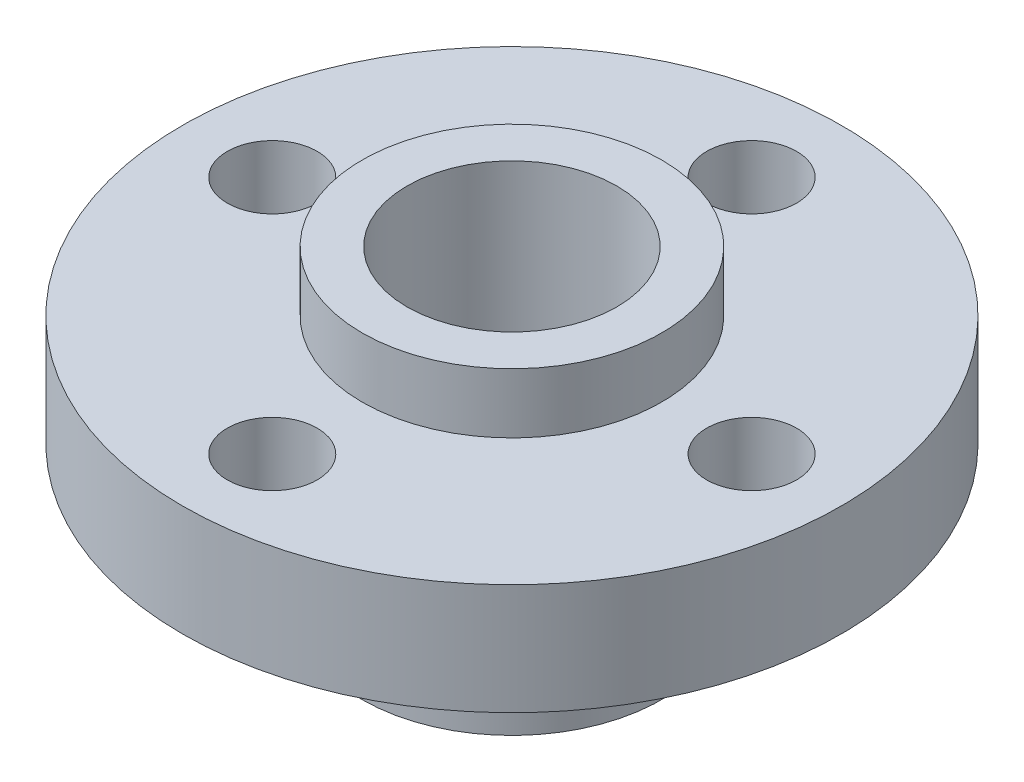
ISO-10303-21;
HEADER;
FILE_DESCRIPTION(('STEP AP214'),'2;1');
FILE_NAME('part.step','',(''),(''),'','','');
FILE_SCHEMA(('AUTOMOTIVE_DESIGN { 1 0 10303 214 1 1 1 1 }'));
ENDSEC;
DATA;
#1=APPLICATION_CONTEXT('core data for automotive mechanical design processes');
#2=APPLICATION_PROTOCOL_DEFINITION('international standard','automotive_design',2000,#1);
#3=PRODUCT_CONTEXT('',#1,'mechanical');
#4=PRODUCT('Part','Part','',(#3));
#5=PRODUCT_RELATED_PRODUCT_CATEGORY('part','',(#4));
#6=PRODUCT_DEFINITION_FORMATION('','',#4);
#7=PRODUCT_DEFINITION_CONTEXT('part definition',#1,'design');
#8=PRODUCT_DEFINITION('design','',#6,#7);
#9=PRODUCT_DEFINITION_SHAPE('','',#8);
#10=(LENGTH_UNIT() NAMED_UNIT(*) SI_UNIT(.MILLI.,.METRE.));
#11=(NAMED_UNIT(*) PLANE_ANGLE_UNIT() SI_UNIT($,.RADIAN.));
#12=(NAMED_UNIT(*) SI_UNIT($,.STERADIAN.) SOLID_ANGLE_UNIT());
#13=UNCERTAINTY_MEASURE_WITH_UNIT(LENGTH_MEASURE(1.E-05),#10,'distance_accuracy_value','');
#14=(GEOMETRIC_REPRESENTATION_CONTEXT(3) GLOBAL_UNCERTAINTY_ASSIGNED_CONTEXT((#13)) GLOBAL_UNIT_ASSIGNED_CONTEXT((#10,
#11,#12)) REPRESENTATION_CONTEXT('',''));
#15=CARTESIAN_POINT('',(0.,0.,0.));
#16=DIRECTION('',(0.,0.,1.));
#17=DIRECTION('',(1.,0.,0.));
#18=AXIS2_PLACEMENT_3D('',#15,#16,#17);
#19=CARTESIAN_POINT('',(0.,3.7,0.));
#20=DIRECTION('',(0.,-1.,0.));
#21=DIRECTION('',(0.,0.,-1.));
#22=AXIS2_PLACEMENT_3D('',#19,#20,#21);
#23=CYLINDRICAL_SURFACE('',#22,11.);
#24=CARTESIAN_POINT('',(0.,3.7,0.));
#25=DIRECTION('',(0.,1.,0.));
#26=DIRECTION('',(0.,0.,1.));
#27=AXIS2_PLACEMENT_3D('',#24,#25,#26);
#28=CIRCLE('',#27,11.);
#29=CARTESIAN_POINT('',(0.,3.7,11.));
#30=VERTEX_POINT('',#29);
#31=EDGE_CURVE('E45',#30,#30,#28,.T.);
#32=ORIENTED_EDGE('',*,*,#31,.F.);
#33=EDGE_LOOP('',(#32));
#34=FACE_BOUND('',#33,.T.);
#35=CARTESIAN_POINT('',(0.,0.,0.));
#36=DIRECTION('',(0.,1.,0.));
#37=DIRECTION('',(0.,0.,1.));
#38=AXIS2_PLACEMENT_3D('',#35,#36,#37);
#39=CIRCLE('',#38,11.);
#40=CARTESIAN_POINT('',(0.,0.,11.));
#41=VERTEX_POINT('',#40);
#42=EDGE_CURVE('E51',#41,#41,#39,.T.);
#43=ORIENTED_EDGE('',*,*,#42,.T.);
#44=EDGE_LOOP('',(#43));
#45=FACE_BOUND('',#44,.T.);
#46=ADVANCED_FACE('F37',(#34,#45),#23,.T.);
#47=CARTESIAN_POINT('',(0.,3.7,0.));
#48=DIRECTION('',(0.,1.,0.));
#49=DIRECTION('',(0.,0.,1.));
#50=AXIS2_PLACEMENT_3D('',#47,#48,#49);
#51=PLANE('',#50);
#52=CARTESIAN_POINT('',(0.,3.7,0.));
#53=DIRECTION('',(0.,1.,0.));
#54=DIRECTION('',(0.,0.,1.));
#55=AXIS2_PLACEMENT_3D('',#52,#53,#54);
#56=CIRCLE('',#55,5.);
#57=CARTESIAN_POINT('',(0.,3.7,5.));
#58=VERTEX_POINT('',#57);
#59=EDGE_CURVE('E10',#58,#58,#56,.T.);
#60=ORIENTED_EDGE('',*,*,#59,.F.);
#61=EDGE_LOOP('',(#60));
#62=FACE_BOUND('',#61,.T.);
#63=CARTESIAN_POINT('',(0.,3.7,-8.));
#64=DIRECTION('',(0.,1.,0.));
#65=DIRECTION('',(0.,0.,1.));
#66=AXIS2_PLACEMENT_3D('',#63,#64,#65);
#67=CIRCLE('',#66,1.5);
#68=CARTESIAN_POINT('',(0.,3.7,-6.5));
#69=VERTEX_POINT('',#68);
#70=EDGE_CURVE('E57',#69,#69,#67,.T.);
#71=ORIENTED_EDGE('',*,*,#70,.F.);
#72=EDGE_LOOP('',(#71));
#73=FACE_BOUND('',#72,.T.);
#74=CARTESIAN_POINT('',(8.,3.7,0.));
#75=DIRECTION('',(0.,1.,0.));
#76=DIRECTION('',(0.,0.,1.));
#77=AXIS2_PLACEMENT_3D('',#74,#75,#76);
#78=CIRCLE('',#77,1.5);
#79=CARTESIAN_POINT('',(8.,3.7,1.5));
#80=VERTEX_POINT('',#79);
#81=EDGE_CURVE('E66',#80,#80,#78,.T.);
#82=ORIENTED_EDGE('',*,*,#81,.F.);
#83=EDGE_LOOP('',(#82));
#84=FACE_BOUND('',#83,.T.);
#85=CARTESIAN_POINT('',(0.,3.7,8.));
#86=DIRECTION('',(0.,1.,0.));
#87=DIRECTION('',(0.,0.,1.));
#88=AXIS2_PLACEMENT_3D('',#85,#86,#87);
#89=CIRCLE('',#88,1.5);
#90=CARTESIAN_POINT('',(0.,3.7,9.5));
#91=VERTEX_POINT('',#90);
#92=EDGE_CURVE('E74',#91,#91,#89,.T.);
#93=ORIENTED_EDGE('',*,*,#92,.F.);
#94=EDGE_LOOP('',(#93));
#95=FACE_BOUND('',#94,.T.);
#96=CARTESIAN_POINT('',(-8.,3.7,0.));
#97=DIRECTION('',(0.,1.,0.));
#98=DIRECTION('',(0.,0.,1.));
#99=AXIS2_PLACEMENT_3D('',#96,#97,#98);
#100=CIRCLE('',#99,1.5);
#101=CARTESIAN_POINT('',(-8.,3.7,1.5));
#102=VERTEX_POINT('',#101);
#103=EDGE_CURVE('E82',#102,#102,#100,.T.);
#104=ORIENTED_EDGE('',*,*,#103,.F.);
#105=EDGE_LOOP('',(#104));
#106=FACE_BOUND('',#105,.T.);
#107=ORIENTED_EDGE('',*,*,#31,.T.);
#108=EDGE_LOOP('',(#107));
#109=FACE_BOUND('',#108,.T.);
#110=ADVANCED_FACE('F96',(#62,#73,#84,#95,#106,#109),#51,.T.);
#111=CARTESIAN_POINT('',(0.,0.,0.));
#112=DIRECTION('',(0.,1.,0.));
#113=DIRECTION('',(0.,0.,1.));
#114=AXIS2_PLACEMENT_3D('',#111,#112,#113);
#115=PLANE('',#114);
#116=CARTESIAN_POINT('',(0.,0.,0.));
#117=DIRECTION('',(0.,1.,0.));
#118=DIRECTION('',(0.,0.,1.));
#119=AXIS2_PLACEMENT_3D('',#116,#117,#118);
#120=CIRCLE('',#119,5.);
#121=CARTESIAN_POINT('',(0.,0.,5.));
#122=VERTEX_POINT('',#121);
#123=EDGE_CURVE('E40',#122,#122,#120,.T.);
#124=ORIENTED_EDGE('',*,*,#123,.T.);
#125=EDGE_LOOP('',(#124));
#126=FACE_BOUND('',#125,.T.);
#127=CARTESIAN_POINT('',(0.,0.,-8.));
#128=DIRECTION('',(0.,1.,0.));
#129=DIRECTION('',(0.,0.,1.));
#130=AXIS2_PLACEMENT_3D('',#127,#128,#129);
#131=CIRCLE('',#130,1.5);
#132=CARTESIAN_POINT('',(0.,0.,-6.5));
#133=VERTEX_POINT('',#132);
#134=EDGE_CURVE('E61',#133,#133,#131,.F.);
#135=ORIENTED_EDGE('',*,*,#134,.F.);
#136=EDGE_LOOP('',(#135));
#137=FACE_BOUND('',#136,.T.);
#138=CARTESIAN_POINT('',(8.,0.,0.));
#139=DIRECTION('',(0.,1.,0.));
#140=DIRECTION('',(0.,0.,1.));
#141=AXIS2_PLACEMENT_3D('',#138,#139,#140);
#142=CIRCLE('',#141,1.5);
#143=CARTESIAN_POINT('',(8.,0.,1.5));
#144=VERTEX_POINT('',#143);
#145=EDGE_CURVE('E62',#144,#144,#142,.F.);
#146=ORIENTED_EDGE('',*,*,#145,.F.);
#147=EDGE_LOOP('',(#146));
#148=FACE_BOUND('',#147,.T.);
#149=CARTESIAN_POINT('',(0.,0.,8.));
#150=DIRECTION('',(0.,1.,0.));
#151=DIRECTION('',(0.,0.,1.));
#152=AXIS2_PLACEMENT_3D('',#149,#150,#151);
#153=CIRCLE('',#152,1.5);
#154=CARTESIAN_POINT('',(0.,0.,9.5));
#155=VERTEX_POINT('',#154);
#156=EDGE_CURVE('E70',#155,#155,#153,.F.);
#157=ORIENTED_EDGE('',*,*,#156,.F.);
#158=EDGE_LOOP('',(#157));
#159=FACE_BOUND('',#158,.T.);
#160=CARTESIAN_POINT('',(-8.,0.,0.));
#161=DIRECTION('',(0.,1.,0.));
#162=DIRECTION('',(0.,0.,1.));
#163=AXIS2_PLACEMENT_3D('',#160,#161,#162);
#164=CIRCLE('',#163,1.5);
#165=CARTESIAN_POINT('',(-8.,0.,1.5));
#166=VERTEX_POINT('',#165);
#167=EDGE_CURVE('E78',#166,#166,#164,.F.);
#168=ORIENTED_EDGE('',*,*,#167,.F.);
#169=EDGE_LOOP('',(#168));
#170=FACE_BOUND('',#169,.T.);
#171=ORIENTED_EDGE('',*,*,#42,.F.);
#172=EDGE_LOOP('',(#171));
#173=FACE_BOUND('',#172,.T.);
#174=ADVANCED_FACE('F93',(#126,#137,#148,#159,#170,#173),#115,.F.);
#175=CARTESIAN_POINT('',(-8.,-0.00100000000000013,0.));
#176=DIRECTION('',(0.,1.,0.));
#177=DIRECTION('',(0.,0.,1.));
#178=AXIS2_PLACEMENT_3D('',#175,#176,#177);
#179=CYLINDRICAL_SURFACE('',#178,1.5);
#180=ORIENTED_EDGE('',*,*,#103,.T.);
#181=EDGE_LOOP('',(#180));
#182=FACE_BOUND('',#181,.T.);
#183=ORIENTED_EDGE('',*,*,#167,.T.);
#184=EDGE_LOOP('',(#183));
#185=FACE_BOUND('',#184,.T.);
#186=ADVANCED_FACE('F95',(#182,#185),#179,.F.);
#187=CARTESIAN_POINT('',(0.,-0.00100000000000013,8.));
#188=DIRECTION('',(0.,1.,0.));
#189=DIRECTION('',(0.,0.,1.));
#190=AXIS2_PLACEMENT_3D('',#187,#188,#189);
#191=CYLINDRICAL_SURFACE('',#190,1.5);
#192=ORIENTED_EDGE('',*,*,#92,.T.);
#193=EDGE_LOOP('',(#192));
#194=FACE_BOUND('',#193,.T.);
#195=ORIENTED_EDGE('',*,*,#156,.T.);
#196=EDGE_LOOP('',(#195));
#197=FACE_BOUND('',#196,.T.);
#198=ADVANCED_FACE('F102',(#194,#197),#191,.F.);
#199=CARTESIAN_POINT('',(8.,-0.00100000000000013,0.));
#200=DIRECTION('',(0.,1.,0.));
#201=DIRECTION('',(0.,0.,1.));
#202=AXIS2_PLACEMENT_3D('',#199,#200,#201);
#203=CYLINDRICAL_SURFACE('',#202,1.5);
#204=ORIENTED_EDGE('',*,*,#81,.T.);
#205=EDGE_LOOP('',(#204));
#206=FACE_BOUND('',#205,.T.);
#207=ORIENTED_EDGE('',*,*,#145,.T.);
#208=EDGE_LOOP('',(#207));
#209=FACE_BOUND('',#208,.T.);
#210=ADVANCED_FACE('F187',(#206,#209),#203,.F.);
#211=CARTESIAN_POINT('',(0.,-0.00100000000000013,-8.));
#212=DIRECTION('',(0.,1.,0.));
#213=DIRECTION('',(0.,0.,1.));
#214=AXIS2_PLACEMENT_3D('',#211,#212,#213);
#215=CYLINDRICAL_SURFACE('',#214,1.5);
#216=ORIENTED_EDGE('',*,*,#70,.T.);
#217=EDGE_LOOP('',(#216));
#218=FACE_BOUND('',#217,.T.);
#219=ORIENTED_EDGE('',*,*,#134,.T.);
#220=EDGE_LOOP('',(#219));
#221=FACE_BOUND('',#220,.T.);
#222=ADVANCED_FACE('F126',(#218,#221),#215,.F.);
#223=CARTESIAN_POINT('',(0.,-4.9,0.));
#224=DIRECTION('',(0.,1.,0.));
#225=DIRECTION('',(0.,0.,1.));
#226=AXIS2_PLACEMENT_3D('',#223,#224,#225);
#227=PLANE('',#226);
#228=CARTESIAN_POINT('',(0.,-4.9,0.));
#229=DIRECTION('',(0.,1.,0.));
#230=DIRECTION('',(0.,0.,1.));
#231=AXIS2_PLACEMENT_3D('',#228,#229,#230);
#232=CIRCLE('',#231,3.5);
#233=CARTESIAN_POINT('',(0.,-4.9,3.5));
#234=VERTEX_POINT('',#233);
#235=EDGE_CURVE('E235',#234,#234,#232,.F.);
#236=ORIENTED_EDGE('',*,*,#235,.F.);
#237=EDGE_LOOP('',(#236));
#238=FACE_BOUND('',#237,.T.);
#239=CARTESIAN_POINT('',(0.,-4.9,0.));
#240=DIRECTION('',(0.,1.,0.));
#241=DIRECTION('',(0.,0.,1.));
#242=AXIS2_PLACEMENT_3D('',#239,#240,#241);
#243=CIRCLE('',#242,5.);
#244=CARTESIAN_POINT('',(0.,-4.9,5.));
#245=VERTEX_POINT('',#244);
#246=EDGE_CURVE('E241',#245,#245,#243,.T.);
#247=ORIENTED_EDGE('',*,*,#246,.F.);
#248=EDGE_LOOP('',(#247));
#249=FACE_BOUND('',#248,.T.);
#250=ADVANCED_FACE('F142',(#238,#249),#227,.F.);
#251=CARTESIAN_POINT('',(0.,-4.9,0.));
#252=DIRECTION('',(0.,1.,0.));
#253=DIRECTION('',(0.,0.,1.));
#254=AXIS2_PLACEMENT_3D('',#251,#252,#253);
#255=CYLINDRICAL_SURFACE('',#254,5.);
#256=ORIENTED_EDGE('',*,*,#246,.T.);
#257=EDGE_LOOP('',(#256));
#258=FACE_BOUND('',#257,.T.);
#259=ORIENTED_EDGE('',*,*,#123,.F.);
#260=EDGE_LOOP('',(#259));
#261=FACE_BOUND('',#260,.T.);
#262=ADVANCED_FACE('F136',(#258,#261),#255,.T.);
#263=ORIENTED_EDGE('',*,*,#59,.T.);
#264=EDGE_LOOP('',(#263));
#265=FACE_BOUND('',#264,.T.);
#266=CARTESIAN_POINT('',(0.,5.7,0.));
#267=DIRECTION('',(0.,1.,0.));
#268=DIRECTION('',(0.,0.,1.));
#269=AXIS2_PLACEMENT_3D('',#266,#267,#268);
#270=CIRCLE('',#269,5.);
#271=CARTESIAN_POINT('',(0.,5.7,5.));
#272=VERTEX_POINT('',#271);
#273=EDGE_CURVE('E55',#272,#272,#270,.T.);
#274=ORIENTED_EDGE('',*,*,#273,.F.);
#275=EDGE_LOOP('',(#274));
#276=FACE_BOUND('',#275,.T.);
#277=ADVANCED_FACE('F141',(#265,#276),#255,.T.);
#278=CARTESIAN_POINT('',(0.,5.7,0.));
#279=DIRECTION('',(0.,1.,0.));
#280=DIRECTION('',(0.,0.,1.));
#281=AXIS2_PLACEMENT_3D('',#278,#279,#280);
#282=PLANE('',#281);
#283=CARTESIAN_POINT('',(0.,5.7,0.));
#284=DIRECTION('',(0.,1.,0.));
#285=DIRECTION('',(0.,0.,1.));
#286=AXIS2_PLACEMENT_3D('',#283,#284,#285);
#287=CIRCLE('',#286,3.5);
#288=CARTESIAN_POINT('',(0.,5.7,3.5));
#289=VERTEX_POINT('',#288);
#290=EDGE_CURVE('E232',#289,#289,#287,.T.);
#291=ORIENTED_EDGE('',*,*,#290,.F.);
#292=EDGE_LOOP('',(#291));
#293=FACE_BOUND('',#292,.T.);
#294=ORIENTED_EDGE('',*,*,#273,.T.);
#295=EDGE_LOOP('',(#294));
#296=FACE_BOUND('',#295,.T.);
#297=ADVANCED_FACE('F154',(#293,#296),#282,.T.);
#298=CARTESIAN_POINT('',(0.,-4.901,0.));
#299=DIRECTION('',(0.,1.,0.));
#300=DIRECTION('',(0.,0.,1.));
#301=AXIS2_PLACEMENT_3D('',#298,#299,#300);
#302=CYLINDRICAL_SURFACE('',#301,3.5);
#303=ORIENTED_EDGE('',*,*,#290,.T.);
#304=EDGE_LOOP('',(#303));
#305=FACE_BOUND('',#304,.T.);
#306=ORIENTED_EDGE('',*,*,#235,.T.);
#307=EDGE_LOOP('',(#306));
#308=FACE_BOUND('',#307,.T.);
#309=ADVANCED_FACE('F169',(#305,#308),#302,.F.);
#310=CLOSED_SHELL('',(#46,#110,#174,#186,#198,#210,#222,#250,#262,#277,#297,#309));
#311=MANIFOLD_SOLID_BREP('B2',#310);
#312=ADVANCED_BREP_SHAPE_REPRESENTATION('',(#18,#311),#14);
#313=SHAPE_DEFINITION_REPRESENTATION(#9,#312);
ENDSEC;
END-ISO-10303-21;
